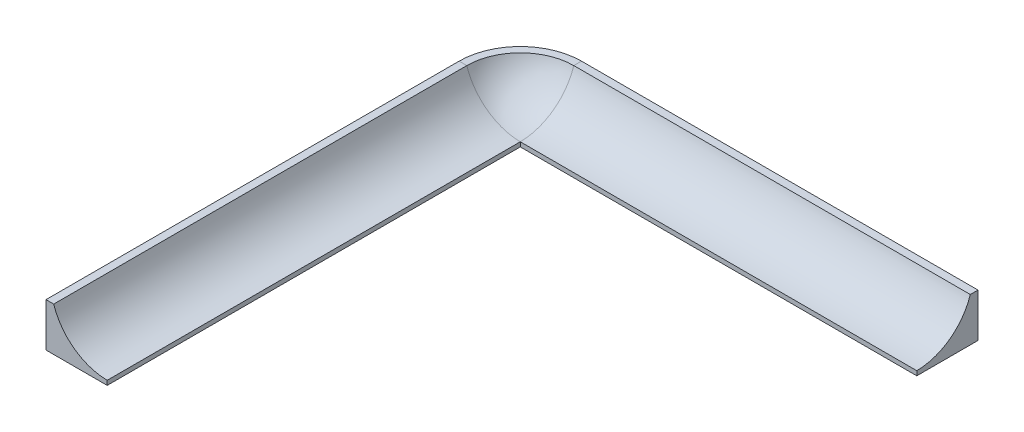
ISO-10303-21;
HEADER;
FILE_DESCRIPTION(('STEP AP214'),'2;1');
FILE_NAME('part.step','',(''),(''),'','','');
FILE_SCHEMA(('AUTOMOTIVE_DESIGN { 1 0 10303 214 1 1 1 1 }'));
ENDSEC;
DATA;
#1=APPLICATION_CONTEXT('core data for automotive mechanical design processes');
#2=APPLICATION_PROTOCOL_DEFINITION('international standard','automotive_design',2000,#1);
#3=PRODUCT_CONTEXT('',#1,'mechanical');
#4=PRODUCT('Part','Part','',(#3));
#5=PRODUCT_RELATED_PRODUCT_CATEGORY('part','',(#4));
#6=PRODUCT_DEFINITION_FORMATION('','',#4);
#7=PRODUCT_DEFINITION_CONTEXT('part definition',#1,'design');
#8=PRODUCT_DEFINITION('design','',#6,#7);
#9=PRODUCT_DEFINITION_SHAPE('','',#8);
#10=(LENGTH_UNIT() NAMED_UNIT(*) SI_UNIT(.MILLI.,.METRE.));
#11=(NAMED_UNIT(*) PLANE_ANGLE_UNIT() SI_UNIT($,.RADIAN.));
#12=(NAMED_UNIT(*) SI_UNIT($,.STERADIAN.) SOLID_ANGLE_UNIT());
#13=UNCERTAINTY_MEASURE_WITH_UNIT(LENGTH_MEASURE(1.E-05),#10,'distance_accuracy_value','');
#14=(GEOMETRIC_REPRESENTATION_CONTEXT(3) GLOBAL_UNCERTAINTY_ASSIGNED_CONTEXT((#13)) GLOBAL_UNIT_ASSIGNED_CONTEXT((#10,
#11,#12)) REPRESENTATION_CONTEXT('',''));
#15=CARTESIAN_POINT('',(0.,0.,0.));
#16=DIRECTION('',(0.,0.,1.));
#17=DIRECTION('',(1.,0.,0.));
#18=AXIS2_PLACEMENT_3D('',#15,#16,#17);
#19=CARTESIAN_POINT('',(114.5,0.,170.));
#20=DIRECTION('',(0.,1.,0.));
#21=DIRECTION('',(0.,0.,1.));
#22=AXIS2_PLACEMENT_3D('',#19,#20,#21);
#23=PLANE('',#22);
#24=CARTESIAN_POINT('',(84.5,0.,-2.8644694359784));
#25=DIRECTION('',(0.,1.,0.));
#26=DIRECTION('',(0.,0.,1.));
#27=AXIS2_PLACEMENT_3D('',#24,#25,#26);
#28=CIRCLE('',#27,1.92499999999998);
#29=CARTESIAN_POINT('',(84.5,0.,-0.939469435978419));
#30=VERTEX_POINT('',#29);
#31=EDGE_CURVE('E288',#30,#30,#28,.T.);
#32=ORIENTED_EDGE('',*,*,#31,.T.);
#33=EDGE_LOOP('',(#32));
#34=FACE_BOUND('',#33,.T.);
#35=CARTESIAN_POINT('',(24.5,0.,-2.8644694359784));
#36=DIRECTION('',(0.,1.,0.));
#37=DIRECTION('',(0.,0.,1.));
#38=AXIS2_PLACEMENT_3D('',#35,#36,#37);
#39=CIRCLE('',#38,1.92500000000007);
#40=CARTESIAN_POINT('',(24.5,0.,-0.939469435978335));
#41=VERTEX_POINT('',#40);
#42=EDGE_CURVE('E292',#41,#41,#39,.T.);
#43=ORIENTED_EDGE('',*,*,#42,.T.);
#44=EDGE_LOOP('',(#43));
#45=FACE_BOUND('',#44,.T.);
#46=CARTESIAN_POINT('',(-2.86446943597833,0.,28.));
#47=DIRECTION('',(0.,1.,0.));
#48=DIRECTION('',(0.,0.,1.));
#49=AXIS2_PLACEMENT_3D('',#46,#47,#48);
#50=CIRCLE('',#49,1.92499999999998);
#51=CARTESIAN_POINT('',(-2.86446943597833,0.,29.925));
#52=VERTEX_POINT('',#51);
#53=EDGE_CURVE('E296',#52,#52,#50,.T.);
#54=ORIENTED_EDGE('',*,*,#53,.T.);
#55=EDGE_LOOP('',(#54));
#56=FACE_BOUND('',#55,.T.);
#57=CARTESIAN_POINT('',(-2.86446943598475,0.,89.));
#58=DIRECTION('',(0.,1.,0.));
#59=DIRECTION('',(0.,0.,1.));
#60=AXIS2_PLACEMENT_3D('',#57,#58,#59);
#61=CIRCLE('',#60,1.90000000000001);
#62=CARTESIAN_POINT('',(-2.86446943598475,0.,87.1));
#63=VERTEX_POINT('',#62);
#64=EDGE_CURVE('E197',#63,#63,#61,.T.);
#65=ORIENTED_EDGE('',*,*,#64,.T.);
#66=EDGE_LOOP('',(#65));
#67=FACE_BOUND('',#66,.T.);
#68=DIRECTION('',(0.,0.,-1.));
#69=VECTOR('',#68,1.);
#70=CARTESIAN_POINT('',(8.00000000000004,0.,170.));
#71=LINE('',#70,#69);
#72=CARTESIAN_POINT('',(8.00000000000002,0.,100.644804872622));
#73=VERTEX_POINT('',#72);
#74=CARTESIAN_POINT('',(8.00000000000001,0.,7.99999999999999));
#75=VERTEX_POINT('',#74);
#76=EDGE_CURVE('E183',#73,#75,#71,.T.);
#77=ORIENTED_EDGE('',*,*,#76,.F.);
#78=DIRECTION('',(1.,0.,0.));
#79=VECTOR('',#78,1.);
#80=CARTESIAN_POINT('',(0.,0.,100.644804872622));
#81=LINE('',#80,#79);
#82=CARTESIAN_POINT('',(-5.72893887195667,0.,100.644804872622));
#83=VERTEX_POINT('',#82);
#84=EDGE_CURVE('E11',#83,#73,#81,.T.);
#85=ORIENTED_EDGE('',*,*,#84,.F.);
#86=DIRECTION('',(0.,0.,-1.));
#87=VECTOR('',#86,1.);
#88=CARTESIAN_POINT('',(-5.72893887195669,0.,183.728938871957));
#89=LINE('',#88,#87);
#90=CARTESIAN_POINT('',(-5.72893887195669,0.,8.00000000000001));
#91=VERTEX_POINT('',#90);
#92=EDGE_CURVE('E132',#83,#91,#89,.T.);
#93=ORIENTED_EDGE('',*,*,#92,.T.);
#94=CARTESIAN_POINT('',(8.,0.,8.));
#95=DIRECTION('',(0.,1.,0.));
#96=DIRECTION('',(0.,0.,1.));
#97=AXIS2_PLACEMENT_3D('',#94,#95,#96);
#98=CIRCLE('',#97,13.7289388719567);
#99=CARTESIAN_POINT('',(7.99999999999998,0.,-5.72893887195669));
#100=VERTEX_POINT('',#99);
#101=EDGE_CURVE('E189',#100,#91,#98,.T.);
#102=ORIENTED_EDGE('',*,*,#101,.F.);
#103=DIRECTION('',(1.,0.,0.));
#104=VECTOR('',#103,1.);
#105=CARTESIAN_POINT('',(234.728938871957,0.,-5.72893887195669));
#106=LINE('',#105,#104);
#107=CARTESIAN_POINT('',(96.924634934383,0.,-5.72893887195669));
#108=VERTEX_POINT('',#107);
#109=EDGE_CURVE('E196',#100,#108,#106,.T.);
#110=ORIENTED_EDGE('',*,*,#109,.T.);
#111=DIRECTION('',(0.,0.,1.));
#112=VECTOR('',#111,1.);
#113=CARTESIAN_POINT('',(96.924634934383,0.,0.));
#114=LINE('',#113,#112);
#115=CARTESIAN_POINT('',(96.924634934383,0.,8.00000000000001));
#116=VERTEX_POINT('',#115);
#117=EDGE_CURVE('E47',#108,#116,#114,.T.);
#118=ORIENTED_EDGE('',*,*,#117,.T.);
#119=DIRECTION('',(1.,0.,0.));
#120=VECTOR('',#119,1.);
#121=CARTESIAN_POINT('',(7.99999999999999,0.,8.00000000000001));
#122=LINE('',#121,#120);
#123=EDGE_CURVE('E169',#75,#116,#122,.T.);
#124=ORIENTED_EDGE('',*,*,#123,.F.);
#125=EDGE_LOOP('',(#77,#85,#93,#102,#110,#118,#124));
#126=FACE_BOUND('',#125,.T.);
#127=ADVANCED_FACE('F44',(#34,#45,#56,#67,#126),#23,.F.);
#128=CARTESIAN_POINT('',(8.00000000000004,1.,170.));
#129=DIRECTION('',(-1.,0.,0.));
#130=DIRECTION('',(0.,0.,1.));
#131=AXIS2_PLACEMENT_3D('',#128,#129,#130);
#132=PLANE('',#131);
#133=DIRECTION('',(0.,1.,0.));
#134=VECTOR('',#133,1.);
#135=CARTESIAN_POINT('',(8.00000000000003,1.,100.644804872622));
#136=LINE('',#135,#134);
#137=CARTESIAN_POINT('',(8.00000000000002,1.,100.644804872622));
#138=VERTEX_POINT('',#137);
#139=EDGE_CURVE('E222',#73,#138,#136,.T.);
#140=ORIENTED_EDGE('',*,*,#139,.F.);
#141=ORIENTED_EDGE('',*,*,#76,.T.);
#142=DIRECTION('',(0.,1.,0.));
#143=VECTOR('',#142,1.);
#144=CARTESIAN_POINT('',(7.99999999999999,1.,8.00000000000001));
#145=LINE('',#144,#143);
#146=CARTESIAN_POINT('',(8.00000000000001,1.,7.99999999999998));
#147=VERTEX_POINT('',#146);
#148=EDGE_CURVE('E179',#75,#147,#145,.T.);
#149=ORIENTED_EDGE('',*,*,#148,.T.);
#150=DIRECTION('',(0.,0.,-1.));
#151=VECTOR('',#150,1.);
#152=CARTESIAN_POINT('',(8.00000000000004,1.,170.));
#153=LINE('',#152,#151);
#154=EDGE_CURVE('E168',#138,#147,#153,.T.);
#155=ORIENTED_EDGE('',*,*,#154,.F.);
#156=EDGE_LOOP('',(#140,#141,#149,#155));
#157=FACE_BOUND('',#156,.T.);
#158=ADVANCED_FACE('F273',(#157),#132,.F.);
#159=CARTESIAN_POINT('',(8.09005776526875,13.7046242253664,170.));
#160=DIRECTION('',(0.,0.,-1.));
#161=DIRECTION('',(-1.,0.,0.));
#162=AXIS2_PLACEMENT_3D('',#159,#160,#161);
#163=CYLINDRICAL_SURFACE('',#162,12.7049434122649);
#164=CARTESIAN_POINT('',(8.09005776526874,13.7046242253664,100.644804872622));
#165=DIRECTION('',(0.,0.,1.));
#166=DIRECTION('',(1.,0.,0.));
#167=AXIS2_PLACEMENT_3D('',#164,#165,#166);
#168=CIRCLE('',#167,12.7049434122649);
#169=CARTESIAN_POINT('',(-4.,9.8,100.644804872622));
#170=VERTEX_POINT('',#169);
#171=EDGE_CURVE('E118',#138,#170,#168,.F.);
#172=ORIENTED_EDGE('',*,*,#171,.F.);
#173=ORIENTED_EDGE('',*,*,#154,.T.);
#174=CARTESIAN_POINT('',(8.09005776526872,13.7046242253664,7.99999999999999));
#175=DIRECTION('',(0.,0.,-1.));
#176=DIRECTION('',(1.,0.,0.));
#177=AXIS2_PLACEMENT_3D('',#174,#175,#176);
#178=CIRCLE('',#177,12.7049434122649);
#179=CARTESIAN_POINT('',(-4.,9.8,7.99999999999998));
#180=VERTEX_POINT('',#179);
#181=EDGE_CURVE('E124',#147,#180,#178,.T.);
#182=ORIENTED_EDGE('',*,*,#181,.T.);
#183=DIRECTION('',(0.,0.,-1.));
#184=VECTOR('',#183,1.);
#185=CARTESIAN_POINT('',(-3.99999999999998,9.8,170.));
#186=LINE('',#185,#184);
#187=EDGE_CURVE('E123',#170,#180,#186,.T.);
#188=ORIENTED_EDGE('',*,*,#187,.F.);
#189=EDGE_LOOP('',(#172,#173,#182,#188));
#190=FACE_BOUND('',#189,.T.);
#191=ADVANCED_FACE('F336',(#190),#163,.F.);
#192=CARTESIAN_POINT('',(-5.72893887195666,9.8,170.));
#193=DIRECTION('',(0.,-1.,0.));
#194=DIRECTION('',(0.,0.,-1.));
#195=AXIS2_PLACEMENT_3D('',#192,#193,#194);
#196=PLANE('',#195);
#197=DIRECTION('',(1.,0.,0.));
#198=VECTOR('',#197,1.);
#199=CARTESIAN_POINT('',(0.,9.8,100.644804872622));
#200=LINE('',#199,#198);
#201=CARTESIAN_POINT('',(-5.72893887195667,9.8,100.644804872622));
#202=VERTEX_POINT('',#201);
#203=EDGE_CURVE('E114',#202,#170,#200,.T.);
#204=ORIENTED_EDGE('',*,*,#203,.T.);
#205=ORIENTED_EDGE('',*,*,#187,.T.);
#206=DIRECTION('',(-1.,0.,0.));
#207=VECTOR('',#206,1.);
#208=CARTESIAN_POINT('',(-5.72893887195669,9.8,7.99999999999999));
#209=LINE('',#208,#207);
#210=CARTESIAN_POINT('',(-5.72893887195668,9.8,7.99999999999998));
#211=VERTEX_POINT('',#210);
#212=EDGE_CURVE('E137',#180,#211,#209,.T.);
#213=ORIENTED_EDGE('',*,*,#212,.T.);
#214=DIRECTION('',(0.,0.,-1.));
#215=VECTOR('',#214,1.);
#216=CARTESIAN_POINT('',(-5.72893887195666,9.8,170.));
#217=LINE('',#216,#215);
#218=EDGE_CURVE('E130',#202,#211,#217,.T.);
#219=ORIENTED_EDGE('',*,*,#218,.F.);
#220=EDGE_LOOP('',(#204,#205,#213,#219));
#221=FACE_BOUND('',#220,.T.);
#222=ADVANCED_FACE('F135',(#221),#196,.F.);
#223=CARTESIAN_POINT('',(-5.72893887195666,-4.2,170.));
#224=DIRECTION('',(1.,0.,0.));
#225=DIRECTION('',(0.,0.,-1.));
#226=AXIS2_PLACEMENT_3D('',#223,#224,#225);
#227=PLANE('',#226);
#228=DIRECTION('',(0.,-1.,0.));
#229=VECTOR('',#228,1.);
#230=CARTESIAN_POINT('',(-5.72893887195667,-4.2,100.644804872622));
#231=LINE('',#230,#229);
#232=EDGE_CURVE('E54',#202,#83,#231,.T.);
#233=ORIENTED_EDGE('',*,*,#232,.F.);
#234=ORIENTED_EDGE('',*,*,#218,.T.);
#235=DIRECTION('',(0.,-1.,0.));
#236=VECTOR('',#235,1.);
#237=CARTESIAN_POINT('',(-5.72893887195669,-4.2,7.99999999999999));
#238=LINE('',#237,#236);
#239=EDGE_CURVE('E140',#211,#91,#238,.T.);
#240=ORIENTED_EDGE('',*,*,#239,.T.);
#241=ORIENTED_EDGE('',*,*,#92,.F.);
#242=EDGE_LOOP('',(#233,#234,#240,#241));
#243=FACE_BOUND('',#242,.T.);
#244=ADVANCED_FACE('F128',(#243),#227,.F.);
#245=CARTESIAN_POINT('',(8.,13.7046242253664,8.09005776526872));
#246=DIRECTION('',(-1.,0.,0.));
#247=DIRECTION('',(0.,0.,-1.));
#248=AXIS2_PLACEMENT_3D('',#245,#246,#247);
#249=CIRCLE('',#248,12.7049434122649);
#250=TRIMMED_CURVE('',#249,(PARAMETER_VALUE(-1.56370786393999)),
(PARAMETER_VALUE(1.56370786393999)),.T.,.PARAMETER.);
#251=CARTESIAN_POINT('',(8.,13.7046242253664,8.));
#252=DIRECTION('',(0.,-1.,0.));
#253=AXIS1_PLACEMENT('',#251,#252);
#254=SURFACE_OF_REVOLUTION('',#250,#253);
#255=CARTESIAN_POINT('',(8.,9.8,8.));
#256=DIRECTION('',(0.,-1.,0.));
#257=DIRECTION('',(-1.,0.,0.));
#258=AXIS2_PLACEMENT_3D('',#255,#256,#257);
#259=CIRCLE('',#258,12.);
#260=CARTESIAN_POINT('',(7.99999999999999,9.8,-4.));
#261=VERTEX_POINT('',#260);
#262=EDGE_CURVE('E157',#180,#261,#259,.T.);
#263=ORIENTED_EDGE('',*,*,#262,.F.);
#264=ORIENTED_EDGE('',*,*,#181,.F.);
#265=CARTESIAN_POINT('',(7.99999999999999,13.7046242253664,8.09005776526872));
#266=DIRECTION('',(1.,0.,0.));
#267=DIRECTION('',(0.,0.,1.));
#268=AXIS2_PLACEMENT_3D('',#265,#266,#267);
#269=CIRCLE('',#268,12.7049434122649);
#270=EDGE_CURVE('E144',#147,#261,#269,.T.);
#271=ORIENTED_EDGE('',*,*,#270,.T.);
#272=EDGE_LOOP('',(#263,#264,#271));
#273=FACE_BOUND('',#272,.T.);
#274=ADVANCED_FACE('F268',(#273),#254,.F.);
#275=CARTESIAN_POINT('',(-5.72893887195669,9.8,7.99999999999999));
#276=DIRECTION('',(0.,-1.,0.));
#277=DIRECTION('',(0.,0.,-1.));
#278=AXIS2_PLACEMENT_3D('',#275,#276,#277);
#279=PLANE('',#278);
#280=CARTESIAN_POINT('',(8.,9.8,8.));
#281=DIRECTION('',(0.,-1.,0.));
#282=DIRECTION('',(-1.,0.,0.));
#283=AXIS2_PLACEMENT_3D('',#280,#281,#282);
#284=CIRCLE('',#283,13.7289388719567);
#285=CARTESIAN_POINT('',(7.99999999999999,9.8,-5.72893887195669));
#286=VERTEX_POINT('',#285);
#287=EDGE_CURVE('E174',#211,#286,#284,.T.);
#288=ORIENTED_EDGE('',*,*,#287,.F.);
#289=ORIENTED_EDGE('',*,*,#212,.F.);
#290=ORIENTED_EDGE('',*,*,#262,.T.);
#291=DIRECTION('',(0.,0.,-1.));
#292=VECTOR('',#291,1.);
#293=CARTESIAN_POINT('',(7.99999999999999,9.8,-5.72893887195669));
#294=LINE('',#293,#292);
#295=EDGE_CURVE('E148',#261,#286,#294,.T.);
#296=ORIENTED_EDGE('',*,*,#295,.T.);
#297=EDGE_LOOP('',(#288,#289,#290,#296));
#298=FACE_BOUND('',#297,.T.);
#299=ADVANCED_FACE('F264',(#298),#279,.F.);
#300=CARTESIAN_POINT('',(8.,0.,8.));
#301=DIRECTION('',(0.,-1.,0.));
#302=DIRECTION('',(0.,0.,-1.));
#303=AXIS2_PLACEMENT_3D('',#300,#301,#302);
#304=CYLINDRICAL_SURFACE('',#303,13.7289388719567);
#305=DIRECTION('',(0.,-1.,0.));
#306=VECTOR('',#305,1.);
#307=CARTESIAN_POINT('',(7.99999999999999,-4.2,-5.72893887195669));
#308=LINE('',#307,#306);
#309=EDGE_CURVE('E193',#286,#100,#308,.T.);
#310=ORIENTED_EDGE('',*,*,#309,.T.);
#311=ORIENTED_EDGE('',*,*,#101,.T.);
#312=ORIENTED_EDGE('',*,*,#239,.F.);
#313=ORIENTED_EDGE('',*,*,#287,.T.);
#314=EDGE_LOOP('',(#310,#311,#312,#313));
#315=FACE_BOUND('',#314,.T.);
#316=ADVANCED_FACE('F263',(#315),#304,.T.);
#317=CARTESIAN_POINT('',(7.99999999999999,1.,8.00000000000001));
#318=DIRECTION('',(0.,0.,-1.));
#319=DIRECTION('',(-1.,0.,0.));
#320=AXIS2_PLACEMENT_3D('',#317,#318,#319);
#321=PLANE('',#320);
#322=ORIENTED_EDGE('',*,*,#123,.T.);
#323=DIRECTION('',(0.,1.,0.));
#324=VECTOR('',#323,1.);
#325=CARTESIAN_POINT('',(96.924634934383,1.,8.00000000000001));
#326=LINE('',#325,#324);
#327=CARTESIAN_POINT('',(96.924634934383,1.,7.99999999999999));
#328=VERTEX_POINT('',#327);
#329=EDGE_CURVE('E173',#116,#328,#326,.T.);
#330=ORIENTED_EDGE('',*,*,#329,.T.);
#331=DIRECTION('',(1.,0.,0.));
#332=VECTOR('',#331,1.);
#333=CARTESIAN_POINT('',(7.99999999999999,1.,8.00000000000001));
#334=LINE('',#333,#332);
#335=EDGE_CURVE('E175',#147,#328,#334,.T.);
#336=ORIENTED_EDGE('',*,*,#335,.F.);
#337=ORIENTED_EDGE('',*,*,#148,.F.);
#338=EDGE_LOOP('',(#322,#330,#336,#337));
#339=FACE_BOUND('',#338,.T.);
#340=ADVANCED_FACE('F278',(#339),#321,.F.);
#341=CARTESIAN_POINT('',(7.99999999999999,13.7046242253664,8.09005776526872));
#342=DIRECTION('',(1.,0.,0.));
#343=DIRECTION('',(0.,0.,-1.));
#344=AXIS2_PLACEMENT_3D('',#341,#342,#343);
#345=CYLINDRICAL_SURFACE('',#344,12.7049434122649);
#346=ORIENTED_EDGE('',*,*,#335,.T.);
#347=CARTESIAN_POINT('',(96.924634934383,13.7046242253664,8.09005776526872));
#348=DIRECTION('',(-1.,0.,0.));
#349=DIRECTION('',(0.,0.,1.));
#350=AXIS2_PLACEMENT_3D('',#347,#348,#349);
#351=CIRCLE('',#350,12.7049434122649);
#352=CARTESIAN_POINT('',(96.924634934383,9.8,-4.));
#353=VERTEX_POINT('',#352);
#354=EDGE_CURVE('E156',#328,#353,#351,.F.);
#355=ORIENTED_EDGE('',*,*,#354,.T.);
#356=DIRECTION('',(1.,0.,0.));
#357=VECTOR('',#356,1.);
#358=CARTESIAN_POINT('',(7.99999999999999,9.8,-4.));
#359=LINE('',#358,#357);
#360=EDGE_CURVE('E151',#261,#353,#359,.T.);
#361=ORIENTED_EDGE('',*,*,#360,.F.);
#362=ORIENTED_EDGE('',*,*,#270,.F.);
#363=EDGE_LOOP('',(#346,#355,#361,#362));
#364=FACE_BOUND('',#363,.T.);
#365=ADVANCED_FACE('F244',(#364),#345,.F.);
#366=CARTESIAN_POINT('',(7.99999999999999,9.8,-5.72893887195669));
#367=DIRECTION('',(0.,-1.,0.));
#368=DIRECTION('',(0.,0.,-1.));
#369=AXIS2_PLACEMENT_3D('',#366,#367,#368);
#370=PLANE('',#369);
#371=ORIENTED_EDGE('',*,*,#360,.T.);
#372=DIRECTION('',(0.,0.,1.));
#373=VECTOR('',#372,1.);
#374=CARTESIAN_POINT('',(96.924634934383,9.8,0.));
#375=LINE('',#374,#373);
#376=CARTESIAN_POINT('',(96.924634934383,9.8,-5.72893887195669));
#377=VERTEX_POINT('',#376);
#378=EDGE_CURVE('E221',#377,#353,#375,.T.);
#379=ORIENTED_EDGE('',*,*,#378,.F.);
#380=DIRECTION('',(1.,0.,0.));
#381=VECTOR('',#380,1.);
#382=CARTESIAN_POINT('',(7.99999999999999,9.8,-5.72893887195669));
#383=LINE('',#382,#381);
#384=EDGE_CURVE('E155',#286,#377,#383,.T.);
#385=ORIENTED_EDGE('',*,*,#384,.F.);
#386=ORIENTED_EDGE('',*,*,#295,.F.);
#387=EDGE_LOOP('',(#371,#379,#385,#386));
#388=FACE_BOUND('',#387,.T.);
#389=ADVANCED_FACE('F248',(#388),#370,.F.);
#390=CARTESIAN_POINT('',(7.99999999999999,-4.2,-5.72893887195669));
#391=DIRECTION('',(0.,0.,1.));
#392=DIRECTION('',(1.,0.,0.));
#393=AXIS2_PLACEMENT_3D('',#390,#391,#392);
#394=PLANE('',#393);
#395=ORIENTED_EDGE('',*,*,#384,.T.);
#396=DIRECTION('',(0.,-1.,0.));
#397=VECTOR('',#396,1.);
#398=CARTESIAN_POINT('',(96.924634934383,-4.2,-5.72893887195669));
#399=LINE('',#398,#397);
#400=EDGE_CURVE('E238',#377,#108,#399,.T.);
#401=ORIENTED_EDGE('',*,*,#400,.T.);
#402=ORIENTED_EDGE('',*,*,#109,.F.);
#403=ORIENTED_EDGE('',*,*,#309,.F.);
#404=EDGE_LOOP('',(#395,#401,#402,#403));
#405=FACE_BOUND('',#404,.T.);
#406=ADVANCED_FACE('F317',(#405),#394,.F.);
#407=CARTESIAN_POINT('',(84.5,4.,-2.8644694359784));
#408=DIRECTION('',(0.,-1.,0.));
#409=DIRECTION('',(0.,0.,-1.));
#410=AXIS2_PLACEMENT_3D('',#407,#408,#409);
#411=CYLINDRICAL_SURFACE('',#410,1.525);
#412=CARTESIAN_POINT('',(84.5,0.399999999999996,-2.8644694359784));
#413=DIRECTION('',(0.,1.,0.));
#414=DIRECTION('',(0.,0.,1.));
#415=AXIS2_PLACEMENT_3D('',#412,#413,#414);
#416=CIRCLE('',#415,1.525);
#417=CARTESIAN_POINT('',(84.5,0.399999999999996,-1.33946943597841));
#418=VERTEX_POINT('',#417);
#419=EDGE_CURVE('E216',#418,#418,#416,.F.);
#420=ORIENTED_EDGE('',*,*,#419,.T.);
#421=EDGE_LOOP('',(#420));
#422=FACE_BOUND('',#421,.T.);
#423=CARTESIAN_POINT('',(84.5,4.,-2.8644694359784));
#424=DIRECTION('',(0.,-1.,0.));
#425=DIRECTION('',(0.,0.,1.));
#426=AXIS2_PLACEMENT_3D('',#423,#424,#425);
#427=CIRCLE('',#426,1.525);
#428=CARTESIAN_POINT('',(84.5,4.,-1.33946943597841));
#429=VERTEX_POINT('',#428);
#430=EDGE_CURVE('E212',#429,#429,#427,.T.);
#431=ORIENTED_EDGE('',*,*,#430,.F.);
#432=EDGE_LOOP('',(#431));
#433=FACE_BOUND('',#432,.T.);
#434=ADVANCED_FACE('F319',(#422,#433),#411,.F.);
#435=CARTESIAN_POINT('',(84.5,4.,-2.8644694359784));
#436=DIRECTION('',(0.,1.,0.));
#437=DIRECTION('',(0.,0.,1.));
#438=AXIS2_PLACEMENT_3D('',#435,#436,#437);
#439=PLANE('',#438);
#440=ORIENTED_EDGE('',*,*,#430,.T.);
#441=EDGE_LOOP('',(#440));
#442=FACE_BOUND('',#441,.T.);
#443=ADVANCED_FACE('F325',(#442),#439,.F.);
#444=CARTESIAN_POINT('',(24.5,4.,-2.8644694359784));
#445=DIRECTION('',(0.,-1.,0.));
#446=DIRECTION('',(0.,0.,-1.));
#447=AXIS2_PLACEMENT_3D('',#444,#445,#446);
#448=CYLINDRICAL_SURFACE('',#447,1.525);
#449=CARTESIAN_POINT('',(24.5,0.400000000000076,-2.8644694359784));
#450=DIRECTION('',(0.,1.,0.));
#451=DIRECTION('',(0.,0.,1.));
#452=AXIS2_PLACEMENT_3D('',#449,#450,#451);
#453=CIRCLE('',#452,1.525);
#454=CARTESIAN_POINT('',(24.5,0.400000000000076,-1.3394694359784));
#455=VERTEX_POINT('',#454);
#456=EDGE_CURVE('E211',#455,#455,#453,.F.);
#457=ORIENTED_EDGE('',*,*,#456,.T.);
#458=EDGE_LOOP('',(#457));
#459=FACE_BOUND('',#458,.T.);
#460=CARTESIAN_POINT('',(24.5,4.,-2.8644694359784));
#461=DIRECTION('',(0.,-1.,0.));
#462=DIRECTION('',(0.,0.,1.));
#463=AXIS2_PLACEMENT_3D('',#460,#461,#462);
#464=CIRCLE('',#463,1.525);
#465=CARTESIAN_POINT('',(24.5,4.,-1.3394694359784));
#466=VERTEX_POINT('',#465);
#467=EDGE_CURVE('E207',#466,#466,#464,.T.);
#468=ORIENTED_EDGE('',*,*,#467,.F.);
#469=EDGE_LOOP('',(#468));
#470=FACE_BOUND('',#469,.T.);
#471=ADVANCED_FACE('F454',(#459,#470),#448,.F.);
#472=CARTESIAN_POINT('',(24.5,4.,-2.8644694359784));
#473=DIRECTION('',(0.,1.,0.));
#474=DIRECTION('',(0.,0.,1.));
#475=AXIS2_PLACEMENT_3D('',#472,#473,#474);
#476=PLANE('',#475);
#477=ORIENTED_EDGE('',*,*,#467,.T.);
#478=EDGE_LOOP('',(#477));
#479=FACE_BOUND('',#478,.T.);
#480=ADVANCED_FACE('F443',(#479),#476,.F.);
#481=CARTESIAN_POINT('',(-2.86446943597833,4.,28.));
#482=DIRECTION('',(0.,-1.,0.));
#483=DIRECTION('',(0.,0.,-1.));
#484=AXIS2_PLACEMENT_3D('',#481,#482,#483);
#485=CYLINDRICAL_SURFACE('',#484,1.52500000000001);
#486=CARTESIAN_POINT('',(-2.86446943597833,0.399999999999985,28.));
#487=DIRECTION('',(0.,1.,0.));
#488=DIRECTION('',(0.,0.,1.));
#489=AXIS2_PLACEMENT_3D('',#486,#487,#488);
#490=CIRCLE('',#489,1.52500000000001);
#491=CARTESIAN_POINT('',(-2.86446943597833,0.399999999999985,29.525));
#492=VERTEX_POINT('',#491);
#493=EDGE_CURVE('E206',#492,#492,#490,.F.);
#494=ORIENTED_EDGE('',*,*,#493,.T.);
#495=EDGE_LOOP('',(#494));
#496=FACE_BOUND('',#495,.T.);
#497=CARTESIAN_POINT('',(-2.86446943597833,4.,28.));
#498=DIRECTION('',(0.,-1.,0.));
#499=DIRECTION('',(0.,0.,1.));
#500=AXIS2_PLACEMENT_3D('',#497,#498,#499);
#501=CIRCLE('',#500,1.52500000000001);
#502=CARTESIAN_POINT('',(-2.86446943597833,4.,29.525));
#503=VERTEX_POINT('',#502);
#504=EDGE_CURVE('E201',#503,#503,#501,.T.);
#505=ORIENTED_EDGE('',*,*,#504,.F.);
#506=EDGE_LOOP('',(#505));
#507=FACE_BOUND('',#506,.T.);
#508=ADVANCED_FACE('F432',(#496,#507),#485,.F.);
#509=CARTESIAN_POINT('',(-2.86446943597833,4.,28.));
#510=DIRECTION('',(0.,1.,0.));
#511=DIRECTION('',(0.,0.,1.));
#512=AXIS2_PLACEMENT_3D('',#509,#510,#511);
#513=PLANE('',#512);
#514=ORIENTED_EDGE('',*,*,#504,.T.);
#515=EDGE_LOOP('',(#514));
#516=FACE_BOUND('',#515,.T.);
#517=ADVANCED_FACE('F356',(#516),#513,.F.);
#518=CARTESIAN_POINT('',(-2.86446943598475,4.,89.));
#519=DIRECTION('',(0.,-1.,0.));
#520=DIRECTION('',(0.,0.,-1.));
#521=AXIS2_PLACEMENT_3D('',#518,#519,#520);
#522=CYLINDRICAL_SURFACE('',#521,1.5);
#523=CARTESIAN_POINT('',(-2.86446943598475,0.400000000000024,89.));
#524=DIRECTION('',(0.,1.,0.));
#525=DIRECTION('',(0.,0.,1.));
#526=AXIS2_PLACEMENT_3D('',#523,#524,#525);
#527=CIRCLE('',#526,1.5);
#528=CARTESIAN_POINT('',(-2.86446943598475,0.400000000000024,87.5));
#529=VERTEX_POINT('',#528);
#530=EDGE_CURVE('E205',#529,#529,#527,.F.);
#531=ORIENTED_EDGE('',*,*,#530,.T.);
#532=EDGE_LOOP('',(#531));
#533=FACE_BOUND('',#532,.T.);
#534=CARTESIAN_POINT('',(-2.86446943598475,4.,89.));
#535=DIRECTION('',(0.,-1.,0.));
#536=DIRECTION('',(0.,0.,-1.));
#537=AXIS2_PLACEMENT_3D('',#534,#535,#536);
#538=CIRCLE('',#537,1.5);
#539=CARTESIAN_POINT('',(-2.86446943598475,4.,87.5));
#540=VERTEX_POINT('',#539);
#541=EDGE_CURVE('E217',#540,#540,#538,.T.);
#542=ORIENTED_EDGE('',*,*,#541,.F.);
#543=EDGE_LOOP('',(#542));
#544=FACE_BOUND('',#543,.T.);
#545=ADVANCED_FACE('F353',(#533,#544),#522,.F.);
#546=CARTESIAN_POINT('',(-2.86446943598475,4.,89.));
#547=DIRECTION('',(0.,-1.,0.));
#548=DIRECTION('',(0.,0.,-1.));
#549=AXIS2_PLACEMENT_3D('',#546,#547,#548);
#550=PLANE('',#549);
#551=ORIENTED_EDGE('',*,*,#541,.T.);
#552=EDGE_LOOP('',(#551));
#553=FACE_BOUND('',#552,.T.);
#554=ADVANCED_FACE('F350',(#553),#550,.T.);
#555=CARTESIAN_POINT('',(-2.86446943598475,0.400000000000024,89.));
#556=DIRECTION('',(0.,-1.,0.));
#557=DIRECTION('',(0.,0.,-1.));
#558=AXIS2_PLACEMENT_3D('',#555,#556,#557);
#559=CONICAL_SURFACE('',#558,1.5,0.785398163397442);
#560=CARTESIAN_POINT('',(-2.86446943598475,0.,87.1));
#561=CARTESIAN_POINT('',(-2.86446943598475,0.00416666666667092,87.1041666666666));
#562=CARTESIAN_POINT('',(-2.86446943598475,0.00833333333333759,87.1083333333333));
#563=CARTESIAN_POINT('',(-2.86446943598475,0.0166666666666709,87.1166666666666));
#564=CARTESIAN_POINT('',(-2.86446943598475,0.0208333333333376,87.1208333333333));
#565=CARTESIAN_POINT('',(-2.86446943598475,0.0291666666666722,87.1291666666666));
#566=CARTESIAN_POINT('',(-2.86446943598475,0.0333333333333401,87.1333333333333));
#567=CARTESIAN_POINT('',(-2.86446943598475,0.0416666666666732,87.1416666666666));
#568=CARTESIAN_POINT('',(-2.86446943598475,0.0458333333333384,87.1458333333333));
#569=CARTESIAN_POINT('',(-2.86446943598475,0.0541666666666716,87.1541666666666));
#570=CARTESIAN_POINT('',(-2.86446943598475,0.0583333333333395,87.1583333333333));
#571=CARTESIAN_POINT('',(-2.86446943598475,0.066666666666674,87.1666666666666));
#572=CARTESIAN_POINT('',(-2.86446943598475,0.0708333333333406,87.1708333333333));
#573=CARTESIAN_POINT('',(-2.86446943598475,0.0791666666666742,87.1791666666666));
#574=CARTESIAN_POINT('',(-2.86446943598475,0.0833333333333411,87.1833333333333));
#575=CARTESIAN_POINT('',(-2.86446943598475,0.0916666666666749,87.1916666666666));
#576=CARTESIAN_POINT('',(-2.86446943598475,0.0958333333333417,87.1958333333333));
#577=CARTESIAN_POINT('',(-2.86446943598475,0.104166666666676,87.2041666666666));
#578=CARTESIAN_POINT('',(-2.86446943598475,0.108333333333342,87.2083333333333));
#579=CARTESIAN_POINT('',(-2.86446943598475,0.116666666666676,87.2166666666666));
#580=CARTESIAN_POINT('',(-2.86446943598475,0.120833333333343,87.2208333333333));
#581=CARTESIAN_POINT('',(-2.86446943598475,0.129166666666677,87.2291666666666));
#582=CARTESIAN_POINT('',(-2.86446943598475,0.133333333333345,87.2333333333333));
#583=CARTESIAN_POINT('',(-2.86446943598475,0.141666666666678,87.2416666666666));
#584=CARTESIAN_POINT('',(-2.86446943598475,0.145833333333343,87.2458333333333));
#585=CARTESIAN_POINT('',(-2.86446943598475,0.154166666666677,87.2541666666666));
#586=CARTESIAN_POINT('',(-2.86446943598475,0.158333333333344,87.2583333333333));
#587=CARTESIAN_POINT('',(-2.86446943598475,0.166666666666679,87.2666666666666));
#588=CARTESIAN_POINT('',(-2.86446943598475,0.170833333333346,87.2708333333333));
#589=CARTESIAN_POINT('',(-2.86446943598475,0.179166666666679,87.2791666666666));
#590=CARTESIAN_POINT('',(-2.86446943598475,0.183333333333346,87.2833333333333));
#591=CARTESIAN_POINT('',(-2.86446943598475,0.19166666666668,87.2916666666666));
#592=CARTESIAN_POINT('',(-2.86446943598475,0.195833333333347,87.2958333333333));
#593=CARTESIAN_POINT('',(-2.86446943598475,0.20416666666668,87.3041666666666));
#594=CARTESIAN_POINT('',(-2.86446943598475,0.208333333333347,87.3083333333333));
#595=CARTESIAN_POINT('',(-2.86446943598475,0.216666666666682,87.3166666666666));
#596=CARTESIAN_POINT('',(-2.86446943598475,0.220833333333349,87.3208333333333));
#597=CARTESIAN_POINT('',(-2.86446943598475,0.229166666666683,87.3291666666666));
#598=CARTESIAN_POINT('',(-2.86446943598475,0.233333333333348,87.3333333333333));
#599=CARTESIAN_POINT('',(-2.86446943598475,0.241666666666681,87.3416666666666));
#600=CARTESIAN_POINT('',(-2.86446943598475,0.245833333333349,87.3458333333333));
#601=CARTESIAN_POINT('',(-2.86446943598475,0.254166666666683,87.3541666666666));
#602=CARTESIAN_POINT('',(-2.86446943598475,0.25833333333335,87.3583333333333));
#603=CARTESIAN_POINT('',(-2.86446943598475,0.266666666666684,87.3666666666666));
#604=CARTESIAN_POINT('',(-2.86446943598475,0.270833333333351,87.3708333333333));
#605=CARTESIAN_POINT('',(-2.86446943598475,0.279166666666684,87.3791666666666));
#606=CARTESIAN_POINT('',(-2.86446943598475,0.283333333333351,87.3833333333333));
#607=CARTESIAN_POINT('',(-2.86446943598475,0.291666666666685,87.3916666666666));
#608=CARTESIAN_POINT('',(-2.86446943598475,0.295833333333352,87.3958333333333));
#609=CARTESIAN_POINT('',(-2.86446943598475,0.304166666666685,87.4041666666666));
#610=CARTESIAN_POINT('',(-2.86446943598475,0.308333333333352,87.4083333333333));
#611=CARTESIAN_POINT('',(-2.86446943598475,0.316666666666686,87.4166666666666));
#612=CARTESIAN_POINT('',(-2.86446943598475,0.320833333333354,87.4208333333333));
#613=CARTESIAN_POINT('',(-2.86446943598475,0.329166666666688,87.4291666666666));
#614=CARTESIAN_POINT('',(-2.86446943598475,0.333333333333353,87.4333333333333));
#615=CARTESIAN_POINT('',(-2.86446943598475,0.341666666666686,87.4416666666666));
#616=CARTESIAN_POINT('',(-2.86446943598475,0.345833333333354,87.4458333333333));
#617=CARTESIAN_POINT('',(-2.86446943598475,0.354166666666688,87.4541666666666));
#618=CARTESIAN_POINT('',(-2.86446943598475,0.358333333333355,87.4583333333333));
#619=CARTESIAN_POINT('',(-2.86446943598475,0.366666666666688,87.4666666666666));
#620=CARTESIAN_POINT('',(-2.86446943598475,0.370833333333355,87.4708333333333));
#621=CARTESIAN_POINT('',(-2.86446943598475,0.379166666666689,87.4791666666666));
#622=CARTESIAN_POINT('',(-2.86446943598475,0.383333333333356,87.4833333333333));
#623=CARTESIAN_POINT('',(-2.86446943598475,0.39166666666669,87.4916666666666));
#624=CARTESIAN_POINT('',(-2.86446943598475,0.395833333333357,87.4958333333333));
#625=CARTESIAN_POINT('',(-2.86446943598475,0.400000000000024,87.5));
#626=B_SPLINE_CURVE_WITH_KNOTS('',3,(#560,#561,#562,#563,#564,#565,#566,#567,#568,#569,#570,
#571,#572,#573,#574,#575,#576,#577,#578,#579,#580,#581,#582,#583,#584,#585,#586,#587,#588,#589,
#590,#591,#592,#593,#594,#595,#596,#597,#598,#599,#600,#601,#602,#603,#604,#605,#606,#607,#608,
#609,#610,#611,#612,#613,#614,#615,#616,#617,#618,#619,#620,#621,#622,#623,#624,#625),
.UNSPECIFIED.,.F.,.F.,(4,2,2,2,2,2,2,2,2,2,2,2,2,2,2,2,2,2,2,2,2,2,2,2,2,2,2,2,2,2,2,2,4),(0.,
0.0176776695296632,0.0353553390593263,0.0530330085889895,0.0707106781186625,0.0883883476483256,
0.106066017177989,0.123743686707652,0.141421356237315,0.159099025766978,0.176776695296641,
0.194454364826305,0.212132034355977,0.229809703885641,0.247487373415304,0.265165042944967,
0.28284271247463,0.300520382004293,0.318198051533956,0.335875721063629,0.353553390593293,
0.371231060122956,0.388908729652619,0.406586399182282,0.424264068711945,0.441941738241608,
0.459619407771271,0.477297077300944,0.494974746830608,0.512652416360271,0.530330085889934,
0.548007755419597,0.56568542494926),.UNSPECIFIED.);
#627=EDGE_CURVE('BSEAM346',#63,#529,#626,.T.);
#628=ORIENTED_EDGE('',*,*,#64,.F.);
#629=ORIENTED_EDGE('',*,*,#530,.F.);
#630=ORIENTED_EDGE('',*,*,#627,.T.);
#631=ORIENTED_EDGE('',*,*,#627,.F.);
#632=EDGE_LOOP('',(#628,#630,#629,#631));
#633=FACE_BOUND('',#632,.T.);
#634=ADVANCED_FACE('F346',(#633),#559,.F.);
#635=CARTESIAN_POINT('',(-2.86446943597833,0.399999999999985,28.));
#636=DIRECTION('',(0.,-1.,0.));
#637=DIRECTION('',(0.,0.,-1.));
#638=AXIS2_PLACEMENT_3D('',#635,#636,#637);
#639=CONICAL_SURFACE('',#638,1.52500000000001,0.785398163397441);
#640=ORIENTED_EDGE('',*,*,#53,.F.);
#641=EDGE_LOOP('',(#640));
#642=FACE_BOUND('',#641,.T.);
#643=ORIENTED_EDGE('',*,*,#493,.F.);
#644=EDGE_LOOP('',(#643));
#645=FACE_BOUND('',#644,.T.);
#646=ADVANCED_FACE('F349',(#642,#645),#639,.F.);
#647=CARTESIAN_POINT('',(24.5,0.400000000000076,-2.8644694359784));
#648=DIRECTION('',(0.,-1.,0.));
#649=DIRECTION('',(0.,0.,-1.));
#650=AXIS2_PLACEMENT_3D('',#647,#648,#649);
#651=CONICAL_SURFACE('',#650,1.525,0.785398163397441);
#652=ORIENTED_EDGE('',*,*,#42,.F.);
#653=EDGE_LOOP('',(#652));
#654=FACE_BOUND('',#653,.T.);
#655=ORIENTED_EDGE('',*,*,#456,.F.);
#656=EDGE_LOOP('',(#655));
#657=FACE_BOUND('',#656,.T.);
#658=ADVANCED_FACE('F382',(#654,#657),#651,.F.);
#659=CARTESIAN_POINT('',(84.5,0.399999999999996,-2.8644694359784));
#660=DIRECTION('',(0.,-1.,0.));
#661=DIRECTION('',(0.,0.,-1.));
#662=AXIS2_PLACEMENT_3D('',#659,#660,#661);
#663=CONICAL_SURFACE('',#662,1.525,0.785398163397441);
#664=ORIENTED_EDGE('',*,*,#31,.F.);
#665=EDGE_LOOP('',(#664));
#666=FACE_BOUND('',#665,.T.);
#667=ORIENTED_EDGE('',*,*,#419,.F.);
#668=EDGE_LOOP('',(#667));
#669=FACE_BOUND('',#668,.T.);
#670=ADVANCED_FACE('F367',(#666,#669),#663,.F.);
#671=CARTESIAN_POINT('',(96.924634934383,0.,0.));
#672=DIRECTION('',(-1.,0.,0.));
#673=DIRECTION('',(0.,0.,1.));
#674=AXIS2_PLACEMENT_3D('',#671,#672,#673);
#675=PLANE('',#674);
#676=ORIENTED_EDGE('',*,*,#117,.F.);
#677=ORIENTED_EDGE('',*,*,#400,.F.);
#678=ORIENTED_EDGE('',*,*,#378,.T.);
#679=ORIENTED_EDGE('',*,*,#354,.F.);
#680=ORIENTED_EDGE('',*,*,#329,.F.);
#681=EDGE_LOOP('',(#676,#677,#678,#679,#680));
#682=FACE_BOUND('',#681,.T.);
#683=ADVANCED_FACE('F236',(#682),#675,.F.);
#684=CARTESIAN_POINT('',(0.,0.,100.644804872622));
#685=DIRECTION('',(0.,0.,1.));
#686=DIRECTION('',(1.,0.,0.));
#687=AXIS2_PLACEMENT_3D('',#684,#685,#686);
#688=PLANE('',#687);
#689=ORIENTED_EDGE('',*,*,#139,.T.);
#690=ORIENTED_EDGE('',*,*,#171,.T.);
#691=ORIENTED_EDGE('',*,*,#203,.F.);
#692=ORIENTED_EDGE('',*,*,#232,.T.);
#693=ORIENTED_EDGE('',*,*,#84,.T.);
#694=EDGE_LOOP('',(#689,#690,#691,#692,#693));
#695=FACE_BOUND('',#694,.T.);
#696=ADVANCED_FACE('F116',(#695),#688,.T.);
#697=CLOSED_SHELL('',(#127,#158,#191,#222,#244,#274,#299,#316,#340,#365,#389,#406,#434,#443,
#471,#480,#508,#517,#545,#554,#634,#646,#658,#670,#683,#696));
#698=MANIFOLD_SOLID_BREP('B2',#697);
#699=ADVANCED_BREP_SHAPE_REPRESENTATION('',(#18,#698),#14);
#700=SHAPE_DEFINITION_REPRESENTATION(#9,#699);
ENDSEC;
END-ISO-10303-21;
